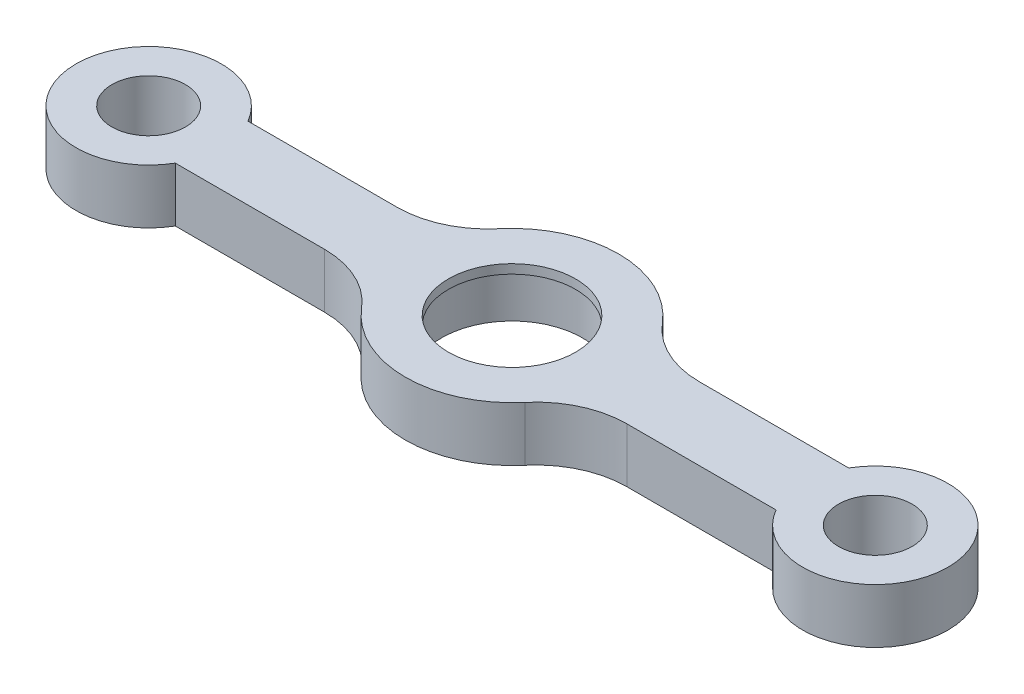
ISO-10303-21;
HEADER;
FILE_DESCRIPTION(('STEP AP214'),'2;1');
FILE_NAME('part.step','',(''),(''),'','','');
FILE_SCHEMA(('AUTOMOTIVE_DESIGN { 1 0 10303 214 1 1 1 1 }'));
ENDSEC;
DATA;
#1=APPLICATION_CONTEXT('core data for automotive mechanical design processes');
#2=APPLICATION_PROTOCOL_DEFINITION('international standard','automotive_design',2000,#1);
#3=PRODUCT_CONTEXT('',#1,'mechanical');
#4=PRODUCT('Part','Part','',(#3));
#5=PRODUCT_RELATED_PRODUCT_CATEGORY('part','',(#4));
#6=PRODUCT_DEFINITION_FORMATION('','',#4);
#7=PRODUCT_DEFINITION_CONTEXT('part definition',#1,'design');
#8=PRODUCT_DEFINITION('design','',#6,#7);
#9=PRODUCT_DEFINITION_SHAPE('','',#8);
#10=(LENGTH_UNIT() NAMED_UNIT(*) SI_UNIT(.MILLI.,.METRE.));
#11=(NAMED_UNIT(*) PLANE_ANGLE_UNIT() SI_UNIT($,.RADIAN.));
#12=(NAMED_UNIT(*) SI_UNIT($,.STERADIAN.) SOLID_ANGLE_UNIT());
#13=UNCERTAINTY_MEASURE_WITH_UNIT(LENGTH_MEASURE(1.E-05),#10,'distance_accuracy_value','');
#14=(GEOMETRIC_REPRESENTATION_CONTEXT(3) GLOBAL_UNCERTAINTY_ASSIGNED_CONTEXT((#13)) GLOBAL_UNIT_ASSIGNED_CONTEXT((#10,
#11,#12)) REPRESENTATION_CONTEXT('',''));
#15=CARTESIAN_POINT('',(0.,0.,0.));
#16=DIRECTION('',(0.,0.,1.));
#17=DIRECTION('',(1.,0.,0.));
#18=AXIS2_PLACEMENT_3D('',#15,#16,#17);
#19=CARTESIAN_POINT('',(0.,6.,0.));
#20=DIRECTION('',(0.,-1.,0.));
#21=DIRECTION('',(0.,0.,-1.));
#22=AXIS2_PLACEMENT_3D('',#19,#20,#21);
#23=CYLINDRICAL_SURFACE('',#22,7.75);
#24=CARTESIAN_POINT('',(0.,0.,0.));
#25=DIRECTION('',(0.,1.,0.));
#26=DIRECTION('',(0.,0.,1.));
#27=AXIS2_PLACEMENT_3D('',#24,#25,#26);
#28=CIRCLE('',#27,7.75);
#29=CARTESIAN_POINT('',(0.,0.,7.75));
#30=VERTEX_POINT('',#29);
#31=EDGE_CURVE('E375',#30,#30,#28,.T.);
#32=ORIENTED_EDGE('',*,*,#31,.F.);
#33=EDGE_LOOP('',(#32));
#34=FACE_BOUND('',#33,.T.);
#35=CARTESIAN_POINT('',(0.,5.,0.));
#36=DIRECTION('',(0.,1.,0.));
#37=DIRECTION('',(0.,0.,1.));
#38=AXIS2_PLACEMENT_3D('',#35,#36,#37);
#39=CIRCLE('',#38,7.75);
#40=CARTESIAN_POINT('',(0.,5.,7.75));
#41=VERTEX_POINT('',#40);
#42=EDGE_CURVE('E370',#41,#41,#39,.T.);
#43=ORIENTED_EDGE('',*,*,#42,.T.);
#44=EDGE_LOOP('',(#43));
#45=FACE_BOUND('',#44,.T.);
#46=ADVANCED_FACE('F33',(#34,#45),#23,.F.);
#47=CARTESIAN_POINT('',(-40.,6.,0.));
#48=DIRECTION('',(0.,1.,0.));
#49=DIRECTION('',(0.,0.,1.));
#50=AXIS2_PLACEMENT_3D('',#47,#48,#49);
#51=PLANE('',#50);
#52=CARTESIAN_POINT('',(-40.,6.,0.));
#53=DIRECTION('',(0.,1.,0.));
#54=DIRECTION('',(0.,0.,1.));
#55=AXIS2_PLACEMENT_3D('',#52,#53,#54);
#56=CIRCLE('',#55,4.05);
#57=CARTESIAN_POINT('',(-40.,6.,4.05));
#58=VERTEX_POINT('',#57);
#59=EDGE_CURVE('E379',#58,#58,#56,.T.);
#60=ORIENTED_EDGE('',*,*,#59,.F.);
#61=EDGE_LOOP('',(#60));
#62=FACE_BOUND('',#61,.T.);
#63=CARTESIAN_POINT('',(-40.,6.,0.));
#64=DIRECTION('',(0.,1.,0.));
#65=DIRECTION('',(0.,0.,1.));
#66=AXIS2_PLACEMENT_3D('',#63,#64,#65);
#67=CIRCLE('',#66,8.00000000000001);
#68=CARTESIAN_POINT('',(-33.0717967697245,6.,-3.99999999999998));
#69=VERTEX_POINT('',#68);
#70=CARTESIAN_POINT('',(-33.0717967697245,6.,4.));
#71=VERTEX_POINT('',#70);
#72=EDGE_CURVE('E178',#69,#71,#67,.T.);
#73=ORIENTED_EDGE('',*,*,#72,.T.);
#74=DIRECTION('',(1.,0.,0.));
#75=VECTOR('',#74,1.);
#76=CARTESIAN_POINT('',(-33.0717967697245,6.,4.));
#77=LINE('',#76,#75);
#78=CARTESIAN_POINT('',(-16.6451945017173,6.,4.));
#79=VERTEX_POINT('',#78);
#80=EDGE_CURVE('E105',#71,#79,#77,.T.);
#81=ORIENTED_EDGE('',*,*,#80,.T.);
#82=CARTESIAN_POINT('',(-16.6451945017173,6.,14.));
#83=DIRECTION('',(0.,-1.,0.));
#84=DIRECTION('',(0.,0.,1.));
#85=AXIS2_PLACEMENT_3D('',#82,#83,#84);
#86=CIRCLE('',#85,10.);
#87=CARTESIAN_POINT('',(-8.99223151242199,6.,7.56321839080459));
#88=VERTEX_POINT('',#87);
#89=EDGE_CURVE('E205',#79,#88,#86,.T.);
#90=ORIENTED_EDGE('',*,*,#89,.T.);
#91=CARTESIAN_POINT('',(0.,6.,0.));
#92=DIRECTION('',(0.,1.,0.));
#93=DIRECTION('',(0.,0.,1.));
#94=AXIS2_PLACEMENT_3D('',#91,#92,#93);
#95=CIRCLE('',#94,11.75);
#96=CARTESIAN_POINT('',(8.99223151242199,6.,7.56321839080459));
#97=VERTEX_POINT('',#96);
#98=EDGE_CURVE('E224',#88,#97,#95,.T.);
#99=ORIENTED_EDGE('',*,*,#98,.T.);
#100=CARTESIAN_POINT('',(16.6451945017173,6.,14.));
#101=DIRECTION('',(0.,-1.,0.));
#102=DIRECTION('',(0.,0.,1.));
#103=AXIS2_PLACEMENT_3D('',#100,#101,#102);
#104=CIRCLE('',#103,10.);
#105=CARTESIAN_POINT('',(16.6451945017173,6.,4.));
#106=VERTEX_POINT('',#105);
#107=EDGE_CURVE('E221',#97,#106,#104,.T.);
#108=ORIENTED_EDGE('',*,*,#107,.T.);
#109=DIRECTION('',(1.,0.,0.));
#110=VECTOR('',#109,1.);
#111=CARTESIAN_POINT('',(16.6451945017173,6.,4.));
#112=LINE('',#111,#110);
#113=CARTESIAN_POINT('',(33.0717967697245,6.,3.99999999999999));
#114=VERTEX_POINT('',#113);
#115=EDGE_CURVE('E223',#106,#114,#112,.T.);
#116=ORIENTED_EDGE('',*,*,#115,.T.);
#117=CARTESIAN_POINT('',(40.,6.,0.));
#118=DIRECTION('',(0.,1.,0.));
#119=DIRECTION('',(0.,0.,1.));
#120=AXIS2_PLACEMENT_3D('',#117,#118,#119);
#121=CIRCLE('',#120,8.00000000000001);
#122=CARTESIAN_POINT('',(33.0717967697245,6.,-3.99999999999999));
#123=VERTEX_POINT('',#122);
#124=EDGE_CURVE('E226',#114,#123,#121,.T.);
#125=ORIENTED_EDGE('',*,*,#124,.T.);
#126=DIRECTION('',(-1.,0.,0.));
#127=VECTOR('',#126,1.);
#128=CARTESIAN_POINT('',(16.6451945017173,6.,-4.));
#129=LINE('',#128,#127);
#130=CARTESIAN_POINT('',(16.6451945017173,6.,-4.));
#131=VERTEX_POINT('',#130);
#132=EDGE_CURVE('E232',#123,#131,#129,.T.);
#133=ORIENTED_EDGE('',*,*,#132,.T.);
#134=CARTESIAN_POINT('',(16.6451945017173,6.,-14.));
#135=DIRECTION('',(0.,-1.,0.));
#136=DIRECTION('',(0.,0.,-1.));
#137=AXIS2_PLACEMENT_3D('',#134,#135,#136);
#138=CIRCLE('',#137,10.);
#139=CARTESIAN_POINT('',(8.99223151242199,6.,-7.5632183908046));
#140=VERTEX_POINT('',#139);
#141=EDGE_CURVE('E137',#131,#140,#138,.T.);
#142=ORIENTED_EDGE('',*,*,#141,.T.);
#143=CARTESIAN_POINT('',(0.,6.,0.));
#144=DIRECTION('',(0.,1.,0.));
#145=DIRECTION('',(0.,0.,1.));
#146=AXIS2_PLACEMENT_3D('',#143,#144,#145);
#147=CIRCLE('',#146,11.75);
#148=CARTESIAN_POINT('',(-8.99223151242199,6.,-7.5632183908046));
#149=VERTEX_POINT('',#148);
#150=EDGE_CURVE('E130',#140,#149,#147,.T.);
#151=ORIENTED_EDGE('',*,*,#150,.T.);
#152=CARTESIAN_POINT('',(-16.6451945017173,6.,-14.));
#153=DIRECTION('',(0.,-1.,0.));
#154=DIRECTION('',(0.,0.,-1.));
#155=AXIS2_PLACEMENT_3D('',#152,#153,#154);
#156=CIRCLE('',#155,10.);
#157=CARTESIAN_POINT('',(-16.6451945017173,6.,-4.));
#158=VERTEX_POINT('',#157);
#159=EDGE_CURVE('E135',#149,#158,#156,.T.);
#160=ORIENTED_EDGE('',*,*,#159,.T.);
#161=DIRECTION('',(-1.,0.,0.));
#162=VECTOR('',#161,1.);
#163=CARTESIAN_POINT('',(-33.0717967697245,6.,-3.99999999999998));
#164=LINE('',#163,#162);
#165=EDGE_CURVE('E50',#158,#69,#164,.T.);
#166=ORIENTED_EDGE('',*,*,#165,.T.);
#167=EDGE_LOOP('',(#73,#81,#90,#99,#108,#116,#125,#133,#142,#151,#160,#166));
#168=FACE_BOUND('',#167,.T.);
#169=CARTESIAN_POINT('',(40.,6.,0.));
#170=DIRECTION('',(0.,1.,0.));
#171=DIRECTION('',(0.,0.,1.));
#172=AXIS2_PLACEMENT_3D('',#169,#170,#171);
#173=CIRCLE('',#172,4.05);
#174=CARTESIAN_POINT('',(40.,6.,4.05));
#175=VERTEX_POINT('',#174);
#176=EDGE_CURVE('E159',#175,#175,#173,.T.);
#177=ORIENTED_EDGE('',*,*,#176,.F.);
#178=EDGE_LOOP('',(#177));
#179=FACE_BOUND('',#178,.T.);
#180=CARTESIAN_POINT('',(0.,6.,0.));
#181=DIRECTION('',(0.,1.,0.));
#182=DIRECTION('',(0.,0.,1.));
#183=AXIS2_PLACEMENT_3D('',#180,#181,#182);
#184=CIRCLE('',#183,7.);
#185=CARTESIAN_POINT('',(0.,6.,7.));
#186=VERTEX_POINT('',#185);
#187=EDGE_CURVE('E367',#186,#186,#184,.T.);
#188=ORIENTED_EDGE('',*,*,#187,.F.);
#189=EDGE_LOOP('',(#188));
#190=FACE_BOUND('',#189,.T.);
#191=ADVANCED_FACE('F132',(#62,#168,#179,#190),#51,.T.);
#192=CARTESIAN_POINT('',(-40.,0.,0.));
#193=DIRECTION('',(0.,1.,0.));
#194=DIRECTION('',(0.,0.,1.));
#195=AXIS2_PLACEMENT_3D('',#192,#193,#194);
#196=PLANE('',#195);
#197=CARTESIAN_POINT('',(-40.,0.,0.));
#198=DIRECTION('',(0.,1.,0.));
#199=DIRECTION('',(0.,0.,1.));
#200=AXIS2_PLACEMENT_3D('',#197,#198,#199);
#201=CIRCLE('',#200,8.00000000000001);
#202=CARTESIAN_POINT('',(-33.0717967697245,0.,-3.99999999999998));
#203=VERTEX_POINT('',#202);
#204=CARTESIAN_POINT('',(-33.0717967697245,0.,4.));
#205=VERTEX_POINT('',#204);
#206=EDGE_CURVE('E155',#203,#205,#201,.T.);
#207=ORIENTED_EDGE('',*,*,#206,.F.);
#208=DIRECTION('',(-1.,0.,0.));
#209=VECTOR('',#208,1.);
#210=CARTESIAN_POINT('',(-33.0717967697245,0.,-3.99999999999998));
#211=LINE('',#210,#209);
#212=CARTESIAN_POINT('',(-16.6451945017173,0.,-4.));
#213=VERTEX_POINT('',#212);
#214=EDGE_CURVE('E97',#213,#203,#211,.T.);
#215=ORIENTED_EDGE('',*,*,#214,.F.);
#216=CARTESIAN_POINT('',(-16.6451945017173,0.,-14.));
#217=DIRECTION('',(0.,-1.,0.));
#218=DIRECTION('',(0.,0.,-1.));
#219=AXIS2_PLACEMENT_3D('',#216,#217,#218);
#220=CIRCLE('',#219,10.);
#221=CARTESIAN_POINT('',(-8.99223151242199,0.,-7.5632183908046));
#222=VERTEX_POINT('',#221);
#223=EDGE_CURVE('E91',#222,#213,#220,.T.);
#224=ORIENTED_EDGE('',*,*,#223,.F.);
#225=CARTESIAN_POINT('',(0.,0.,0.));
#226=DIRECTION('',(0.,1.,0.));
#227=DIRECTION('',(0.,0.,1.));
#228=AXIS2_PLACEMENT_3D('',#225,#226,#227);
#229=CIRCLE('',#228,11.75);
#230=CARTESIAN_POINT('',(8.99223151242199,0.,-7.5632183908046));
#231=VERTEX_POINT('',#230);
#232=EDGE_CURVE('E145',#231,#222,#229,.T.);
#233=ORIENTED_EDGE('',*,*,#232,.F.);
#234=CARTESIAN_POINT('',(16.6451945017173,0.,-14.));
#235=DIRECTION('',(0.,-1.,0.));
#236=DIRECTION('',(0.,0.,-1.));
#237=AXIS2_PLACEMENT_3D('',#234,#235,#236);
#238=CIRCLE('',#237,10.);
#239=CARTESIAN_POINT('',(16.6451945017173,0.,-4.));
#240=VERTEX_POINT('',#239);
#241=EDGE_CURVE('E173',#240,#231,#238,.T.);
#242=ORIENTED_EDGE('',*,*,#241,.F.);
#243=DIRECTION('',(-1.,0.,0.));
#244=VECTOR('',#243,1.);
#245=CARTESIAN_POINT('',(16.6451945017173,0.,-4.));
#246=LINE('',#245,#244);
#247=CARTESIAN_POINT('',(33.0717967697245,0.,-3.99999999999999));
#248=VERTEX_POINT('',#247);
#249=EDGE_CURVE('E171',#248,#240,#246,.T.);
#250=ORIENTED_EDGE('',*,*,#249,.F.);
#251=CARTESIAN_POINT('',(40.,0.,0.));
#252=DIRECTION('',(0.,1.,0.));
#253=DIRECTION('',(0.,0.,1.));
#254=AXIS2_PLACEMENT_3D('',#251,#252,#253);
#255=CIRCLE('',#254,8.00000000000001);
#256=CARTESIAN_POINT('',(33.0717967697245,0.,3.99999999999999));
#257=VERTEX_POINT('',#256);
#258=EDGE_CURVE('E169',#257,#248,#255,.T.);
#259=ORIENTED_EDGE('',*,*,#258,.F.);
#260=DIRECTION('',(1.,0.,0.));
#261=VECTOR('',#260,1.);
#262=CARTESIAN_POINT('',(16.6451945017173,0.,4.));
#263=LINE('',#262,#261);
#264=CARTESIAN_POINT('',(16.6451945017173,0.,4.));
#265=VERTEX_POINT('',#264);
#266=EDGE_CURVE('E167',#265,#257,#263,.T.);
#267=ORIENTED_EDGE('',*,*,#266,.F.);
#268=CARTESIAN_POINT('',(16.6451945017173,0.,14.));
#269=DIRECTION('',(0.,-1.,0.));
#270=DIRECTION('',(0.,0.,1.));
#271=AXIS2_PLACEMENT_3D('',#268,#269,#270);
#272=CIRCLE('',#271,10.);
#273=CARTESIAN_POINT('',(8.99223151242199,0.,7.56321839080459));
#274=VERTEX_POINT('',#273);
#275=EDGE_CURVE('E165',#274,#265,#272,.T.);
#276=ORIENTED_EDGE('',*,*,#275,.F.);
#277=CARTESIAN_POINT('',(0.,0.,0.));
#278=DIRECTION('',(0.,1.,0.));
#279=DIRECTION('',(0.,0.,1.));
#280=AXIS2_PLACEMENT_3D('',#277,#278,#279);
#281=CIRCLE('',#280,11.75);
#282=CARTESIAN_POINT('',(-8.99223151242199,0.,7.56321839080459));
#283=VERTEX_POINT('',#282);
#284=EDGE_CURVE('E163',#283,#274,#281,.T.);
#285=ORIENTED_EDGE('',*,*,#284,.F.);
#286=CARTESIAN_POINT('',(-16.6451945017173,0.,14.));
#287=DIRECTION('',(0.,-1.,0.));
#288=DIRECTION('',(0.,0.,1.));
#289=AXIS2_PLACEMENT_3D('',#286,#287,#288);
#290=CIRCLE('',#289,10.);
#291=CARTESIAN_POINT('',(-16.6451945017173,0.,4.));
#292=VERTEX_POINT('',#291);
#293=EDGE_CURVE('E161',#292,#283,#290,.T.);
#294=ORIENTED_EDGE('',*,*,#293,.F.);
#295=DIRECTION('',(1.,0.,0.));
#296=VECTOR('',#295,1.);
#297=CARTESIAN_POINT('',(-33.0717967697245,0.,4.));
#298=LINE('',#297,#296);
#299=EDGE_CURVE('E158',#205,#292,#298,.T.);
#300=ORIENTED_EDGE('',*,*,#299,.F.);
#301=EDGE_LOOP('',(#207,#215,#224,#233,#242,#250,#259,#267,#276,#285,#294,#300));
#302=FACE_BOUND('',#301,.T.);
#303=CARTESIAN_POINT('',(40.,0.,0.));
#304=DIRECTION('',(0.,1.,0.));
#305=DIRECTION('',(0.,0.,1.));
#306=AXIS2_PLACEMENT_3D('',#303,#304,#305);
#307=CIRCLE('',#306,4.05);
#308=CARTESIAN_POINT('',(40.,0.,4.05));
#309=VERTEX_POINT('',#308);
#310=EDGE_CURVE('E382',#309,#309,#307,.T.);
#311=ORIENTED_EDGE('',*,*,#310,.T.);
#312=EDGE_LOOP('',(#311));
#313=FACE_BOUND('',#312,.T.);
#314=CARTESIAN_POINT('',(-40.,0.,0.));
#315=DIRECTION('',(0.,1.,0.));
#316=DIRECTION('',(0.,0.,1.));
#317=AXIS2_PLACEMENT_3D('',#314,#315,#316);
#318=CIRCLE('',#317,4.05);
#319=CARTESIAN_POINT('',(-40.,0.,4.05));
#320=VERTEX_POINT('',#319);
#321=EDGE_CURVE('E378',#320,#320,#318,.T.);
#322=ORIENTED_EDGE('',*,*,#321,.T.);
#323=EDGE_LOOP('',(#322));
#324=FACE_BOUND('',#323,.T.);
#325=ORIENTED_EDGE('',*,*,#31,.T.);
#326=EDGE_LOOP('',(#325));
#327=FACE_BOUND('',#326,.T.);
#328=ADVANCED_FACE('F209',(#302,#313,#324,#327),#196,.F.);
#329=CARTESIAN_POINT('',(-40.,6.,0.));
#330=DIRECTION('',(0.,-1.,0.));
#331=DIRECTION('',(0.,0.,-1.));
#332=AXIS2_PLACEMENT_3D('',#329,#330,#331);
#333=CYLINDRICAL_SURFACE('',#332,8.00000000000001);
#334=ORIENTED_EDGE('',*,*,#206,.T.);
#335=DIRECTION('',(0.,-1.,0.));
#336=VECTOR('',#335,1.);
#337=CARTESIAN_POINT('',(-33.0717967697245,6.,4.));
#338=LINE('',#337,#336);
#339=EDGE_CURVE('E11',#71,#205,#338,.T.);
#340=ORIENTED_EDGE('',*,*,#339,.F.);
#341=ORIENTED_EDGE('',*,*,#72,.F.);
#342=DIRECTION('',(0.,-1.,0.));
#343=VECTOR('',#342,1.);
#344=CARTESIAN_POINT('',(-33.0717967697245,6.,-3.99999999999998));
#345=LINE('',#344,#343);
#346=EDGE_CURVE('E151',#69,#203,#345,.T.);
#347=ORIENTED_EDGE('',*,*,#346,.T.);
#348=EDGE_LOOP('',(#334,#340,#341,#347));
#349=FACE_BOUND('',#348,.T.);
#350=ADVANCED_FACE('F35',(#349),#333,.T.);
#351=CARTESIAN_POINT('',(-33.0717967697245,6.,4.));
#352=DIRECTION('',(0.,0.,-1.));
#353=DIRECTION('',(-1.,0.,0.));
#354=AXIS2_PLACEMENT_3D('',#351,#352,#353);
#355=PLANE('',#354);
#356=ORIENTED_EDGE('',*,*,#299,.T.);
#357=DIRECTION('',(0.,-1.,0.));
#358=VECTOR('',#357,1.);
#359=CARTESIAN_POINT('',(-16.6451945017173,6.,4.));
#360=LINE('',#359,#358);
#361=EDGE_CURVE('E42',#79,#292,#360,.T.);
#362=ORIENTED_EDGE('',*,*,#361,.F.);
#363=ORIENTED_EDGE('',*,*,#80,.F.);
#364=ORIENTED_EDGE('',*,*,#339,.T.);
#365=EDGE_LOOP('',(#356,#362,#363,#364));
#366=FACE_BOUND('',#365,.T.);
#367=ADVANCED_FACE('F279',(#366),#355,.F.);
#368=CARTESIAN_POINT('',(-16.6451945017173,6.,14.));
#369=DIRECTION('',(0.,-1.,0.));
#370=DIRECTION('',(0.,0.,-1.));
#371=AXIS2_PLACEMENT_3D('',#368,#369,#370);
#372=CYLINDRICAL_SURFACE('',#371,10.);
#373=ORIENTED_EDGE('',*,*,#293,.T.);
#374=DIRECTION('',(0.,-1.,0.));
#375=VECTOR('',#374,1.);
#376=CARTESIAN_POINT('',(-8.99223151242199,6.,7.56321839080459));
#377=LINE('',#376,#375);
#378=EDGE_CURVE('E197',#88,#283,#377,.T.);
#379=ORIENTED_EDGE('',*,*,#378,.F.);
#380=ORIENTED_EDGE('',*,*,#89,.F.);
#381=ORIENTED_EDGE('',*,*,#361,.T.);
#382=EDGE_LOOP('',(#373,#379,#380,#381));
#383=FACE_BOUND('',#382,.T.);
#384=ADVANCED_FACE('F203',(#383),#372,.F.);
#385=CARTESIAN_POINT('',(0.,6.,0.));
#386=DIRECTION('',(0.,-1.,0.));
#387=DIRECTION('',(0.,0.,-1.));
#388=AXIS2_PLACEMENT_3D('',#385,#386,#387);
#389=CYLINDRICAL_SURFACE('',#388,11.75);
#390=ORIENTED_EDGE('',*,*,#284,.T.);
#391=DIRECTION('',(0.,-1.,0.));
#392=VECTOR('',#391,1.);
#393=CARTESIAN_POINT('',(8.99223151242199,6.,7.56321839080459));
#394=LINE('',#393,#392);
#395=EDGE_CURVE('E194',#97,#274,#394,.T.);
#396=ORIENTED_EDGE('',*,*,#395,.F.);
#397=ORIENTED_EDGE('',*,*,#98,.F.);
#398=ORIENTED_EDGE('',*,*,#378,.T.);
#399=EDGE_LOOP('',(#390,#396,#397,#398));
#400=FACE_BOUND('',#399,.T.);
#401=ADVANCED_FACE('F215',(#400),#389,.T.);
#402=CARTESIAN_POINT('',(16.6451945017173,6.,14.));
#403=DIRECTION('',(0.,-1.,0.));
#404=DIRECTION('',(0.,0.,-1.));
#405=AXIS2_PLACEMENT_3D('',#402,#403,#404);
#406=CYLINDRICAL_SURFACE('',#405,10.);
#407=ORIENTED_EDGE('',*,*,#275,.T.);
#408=DIRECTION('',(0.,-1.,0.));
#409=VECTOR('',#408,1.);
#410=CARTESIAN_POINT('',(16.6451945017173,6.,4.));
#411=LINE('',#410,#409);
#412=EDGE_CURVE('E191',#106,#265,#411,.T.);
#413=ORIENTED_EDGE('',*,*,#412,.F.);
#414=ORIENTED_EDGE('',*,*,#107,.F.);
#415=ORIENTED_EDGE('',*,*,#395,.T.);
#416=EDGE_LOOP('',(#407,#413,#414,#415));
#417=FACE_BOUND('',#416,.T.);
#418=ADVANCED_FACE('F219',(#417),#406,.F.);
#419=CARTESIAN_POINT('',(16.6451945017173,6.,4.));
#420=DIRECTION('',(0.,0.,-1.));
#421=DIRECTION('',(-1.,0.,0.));
#422=AXIS2_PLACEMENT_3D('',#419,#420,#421);
#423=PLANE('',#422);
#424=ORIENTED_EDGE('',*,*,#266,.T.);
#425=DIRECTION('',(0.,-1.,0.));
#426=VECTOR('',#425,1.);
#427=CARTESIAN_POINT('',(33.0717967697245,6.,3.99999999999999));
#428=LINE('',#427,#426);
#429=EDGE_CURVE('E188',#114,#257,#428,.T.);
#430=ORIENTED_EDGE('',*,*,#429,.F.);
#431=ORIENTED_EDGE('',*,*,#115,.F.);
#432=ORIENTED_EDGE('',*,*,#412,.T.);
#433=EDGE_LOOP('',(#424,#430,#431,#432));
#434=FACE_BOUND('',#433,.T.);
#435=ADVANCED_FACE('F292',(#434),#423,.F.);
#436=CARTESIAN_POINT('',(40.,6.,0.));
#437=DIRECTION('',(0.,-1.,0.));
#438=DIRECTION('',(0.,0.,-1.));
#439=AXIS2_PLACEMENT_3D('',#436,#437,#438);
#440=CYLINDRICAL_SURFACE('',#439,8.00000000000001);
#441=ORIENTED_EDGE('',*,*,#258,.T.);
#442=DIRECTION('',(0.,-1.,0.));
#443=VECTOR('',#442,1.);
#444=CARTESIAN_POINT('',(33.0717967697245,6.,-3.99999999999999));
#445=LINE('',#444,#443);
#446=EDGE_CURVE('E185',#123,#248,#445,.T.);
#447=ORIENTED_EDGE('',*,*,#446,.F.);
#448=ORIENTED_EDGE('',*,*,#124,.F.);
#449=ORIENTED_EDGE('',*,*,#429,.T.);
#450=EDGE_LOOP('',(#441,#447,#448,#449));
#451=FACE_BOUND('',#450,.T.);
#452=ADVANCED_FACE('F295',(#451),#440,.T.);
#453=CARTESIAN_POINT('',(16.6451945017173,6.,-4.));
#454=DIRECTION('',(0.,0.,1.));
#455=DIRECTION('',(1.,0.,0.));
#456=AXIS2_PLACEMENT_3D('',#453,#454,#455);
#457=PLANE('',#456);
#458=ORIENTED_EDGE('',*,*,#249,.T.);
#459=DIRECTION('',(0.,-1.,0.));
#460=VECTOR('',#459,1.);
#461=CARTESIAN_POINT('',(16.6451945017173,6.,-4.));
#462=LINE('',#461,#460);
#463=EDGE_CURVE('E182',#131,#240,#462,.T.);
#464=ORIENTED_EDGE('',*,*,#463,.F.);
#465=ORIENTED_EDGE('',*,*,#132,.F.);
#466=ORIENTED_EDGE('',*,*,#446,.T.);
#467=EDGE_LOOP('',(#458,#464,#465,#466));
#468=FACE_BOUND('',#467,.T.);
#469=ADVANCED_FACE('F238',(#468),#457,.F.);
#470=CARTESIAN_POINT('',(16.6451945017173,6.,-14.));
#471=DIRECTION('',(0.,-1.,0.));
#472=DIRECTION('',(0.,0.,-1.));
#473=AXIS2_PLACEMENT_3D('',#470,#471,#472);
#474=CYLINDRICAL_SURFACE('',#473,10.);
#475=ORIENTED_EDGE('',*,*,#241,.T.);
#476=DIRECTION('',(0.,-1.,0.));
#477=VECTOR('',#476,1.);
#478=CARTESIAN_POINT('',(8.99223151242199,6.,-7.5632183908046));
#479=LINE('',#478,#477);
#480=EDGE_CURVE('E146',#140,#231,#479,.T.);
#481=ORIENTED_EDGE('',*,*,#480,.F.);
#482=ORIENTED_EDGE('',*,*,#141,.F.);
#483=ORIENTED_EDGE('',*,*,#463,.T.);
#484=EDGE_LOOP('',(#475,#481,#482,#483));
#485=FACE_BOUND('',#484,.T.);
#486=ADVANCED_FACE('F242',(#485),#474,.F.);
#487=CARTESIAN_POINT('',(0.,6.,0.));
#488=DIRECTION('',(0.,-1.,0.));
#489=DIRECTION('',(0.,0.,-1.));
#490=AXIS2_PLACEMENT_3D('',#487,#488,#489);
#491=CYLINDRICAL_SURFACE('',#490,11.75);
#492=ORIENTED_EDGE('',*,*,#232,.T.);
#493=DIRECTION('',(0.,-1.,0.));
#494=VECTOR('',#493,1.);
#495=CARTESIAN_POINT('',(-8.99223151242199,6.,-7.5632183908046));
#496=LINE('',#495,#494);
#497=EDGE_CURVE('E142',#149,#222,#496,.T.);
#498=ORIENTED_EDGE('',*,*,#497,.F.);
#499=ORIENTED_EDGE('',*,*,#150,.F.);
#500=ORIENTED_EDGE('',*,*,#480,.T.);
#501=EDGE_LOOP('',(#492,#498,#499,#500));
#502=FACE_BOUND('',#501,.T.);
#503=ADVANCED_FACE('F143',(#502),#491,.T.);
#504=CARTESIAN_POINT('',(-16.6451945017173,6.,-14.));
#505=DIRECTION('',(0.,-1.,0.));
#506=DIRECTION('',(0.,0.,-1.));
#507=AXIS2_PLACEMENT_3D('',#504,#505,#506);
#508=CYLINDRICAL_SURFACE('',#507,10.);
#509=ORIENTED_EDGE('',*,*,#223,.T.);
#510=DIRECTION('',(0.,-1.,0.));
#511=VECTOR('',#510,1.);
#512=CARTESIAN_POINT('',(-16.6451945017173,6.,-4.));
#513=LINE('',#512,#511);
#514=EDGE_CURVE('E147',#158,#213,#513,.T.);
#515=ORIENTED_EDGE('',*,*,#514,.F.);
#516=ORIENTED_EDGE('',*,*,#159,.F.);
#517=ORIENTED_EDGE('',*,*,#497,.T.);
#518=EDGE_LOOP('',(#509,#515,#516,#517));
#519=FACE_BOUND('',#518,.T.);
#520=ADVANCED_FACE('F149',(#519),#508,.F.);
#521=CARTESIAN_POINT('',(-33.0717967697245,6.,-3.99999999999998));
#522=DIRECTION('',(0.,0.,1.));
#523=DIRECTION('',(1.,0.,0.));
#524=AXIS2_PLACEMENT_3D('',#521,#522,#523);
#525=PLANE('',#524);
#526=ORIENTED_EDGE('',*,*,#214,.T.);
#527=ORIENTED_EDGE('',*,*,#346,.F.);
#528=ORIENTED_EDGE('',*,*,#165,.F.);
#529=ORIENTED_EDGE('',*,*,#514,.T.);
#530=EDGE_LOOP('',(#526,#527,#528,#529));
#531=FACE_BOUND('',#530,.T.);
#532=ADVANCED_FACE('F246',(#531),#525,.F.);
#533=CARTESIAN_POINT('',(40.,6.,0.));
#534=DIRECTION('',(0.,-1.,0.));
#535=DIRECTION('',(0.,0.,-1.));
#536=AXIS2_PLACEMENT_3D('',#533,#534,#535);
#537=CYLINDRICAL_SURFACE('',#536,4.05);
#538=ORIENTED_EDGE('',*,*,#176,.T.);
#539=EDGE_LOOP('',(#538));
#540=FACE_BOUND('',#539,.T.);
#541=ORIENTED_EDGE('',*,*,#310,.F.);
#542=EDGE_LOOP('',(#541));
#543=FACE_BOUND('',#542,.T.);
#544=ADVANCED_FACE('F248',(#540,#543),#537,.F.);
#545=CARTESIAN_POINT('',(-40.,6.,0.));
#546=DIRECTION('',(0.,-1.,0.));
#547=DIRECTION('',(0.,0.,-1.));
#548=AXIS2_PLACEMENT_3D('',#545,#546,#547);
#549=CYLINDRICAL_SURFACE('',#548,4.05);
#550=ORIENTED_EDGE('',*,*,#59,.T.);
#551=EDGE_LOOP('',(#550));
#552=FACE_BOUND('',#551,.T.);
#553=ORIENTED_EDGE('',*,*,#321,.F.);
#554=EDGE_LOOP('',(#553));
#555=FACE_BOUND('',#554,.T.);
#556=ADVANCED_FACE('F254',(#552,#555),#549,.F.);
#557=CARTESIAN_POINT('',(0.,5.,0.));
#558=DIRECTION('',(0.,1.,0.));
#559=DIRECTION('',(0.,0.,1.));
#560=AXIS2_PLACEMENT_3D('',#557,#558,#559);
#561=PLANE('',#560);
#562=CARTESIAN_POINT('',(0.,5.,0.));
#563=DIRECTION('',(0.,1.,0.));
#564=DIRECTION('',(0.,0.,1.));
#565=AXIS2_PLACEMENT_3D('',#562,#563,#564);
#566=CIRCLE('',#565,7.);
#567=CARTESIAN_POINT('',(0.,5.,7.));
#568=VERTEX_POINT('',#567);
#569=EDGE_CURVE('E364',#568,#568,#566,.T.);
#570=ORIENTED_EDGE('',*,*,#569,.T.);
#571=EDGE_LOOP('',(#570));
#572=FACE_BOUND('',#571,.T.);
#573=ORIENTED_EDGE('',*,*,#42,.F.);
#574=EDGE_LOOP('',(#573));
#575=FACE_BOUND('',#574,.T.);
#576=ADVANCED_FACE('F271',(#572,#575),#561,.F.);
#577=CARTESIAN_POINT('',(0.,5.,0.));
#578=DIRECTION('',(0.,1.,0.));
#579=DIRECTION('',(0.,0.,1.));
#580=AXIS2_PLACEMENT_3D('',#577,#578,#579);
#581=CYLINDRICAL_SURFACE('',#580,7.);
#582=ORIENTED_EDGE('',*,*,#569,.F.);
#583=EDGE_LOOP('',(#582));
#584=FACE_BOUND('',#583,.T.);
#585=ORIENTED_EDGE('',*,*,#187,.T.);
#586=EDGE_LOOP('',(#585));
#587=FACE_BOUND('',#586,.T.);
#588=ADVANCED_FACE('F349',(#584,#587),#581,.F.);
#589=CLOSED_SHELL('',(#46,#191,#328,#350,#367,#384,#401,#418,#435,#452,#469,#486,#503,#520,#532,
#544,#556,#576,#588));
#590=MANIFOLD_SOLID_BREP('B2',#589);
#591=ADVANCED_BREP_SHAPE_REPRESENTATION('',(#18,#590),#14);
#592=SHAPE_DEFINITION_REPRESENTATION(#9,#591);
ENDSEC;
END-ISO-10303-21;
